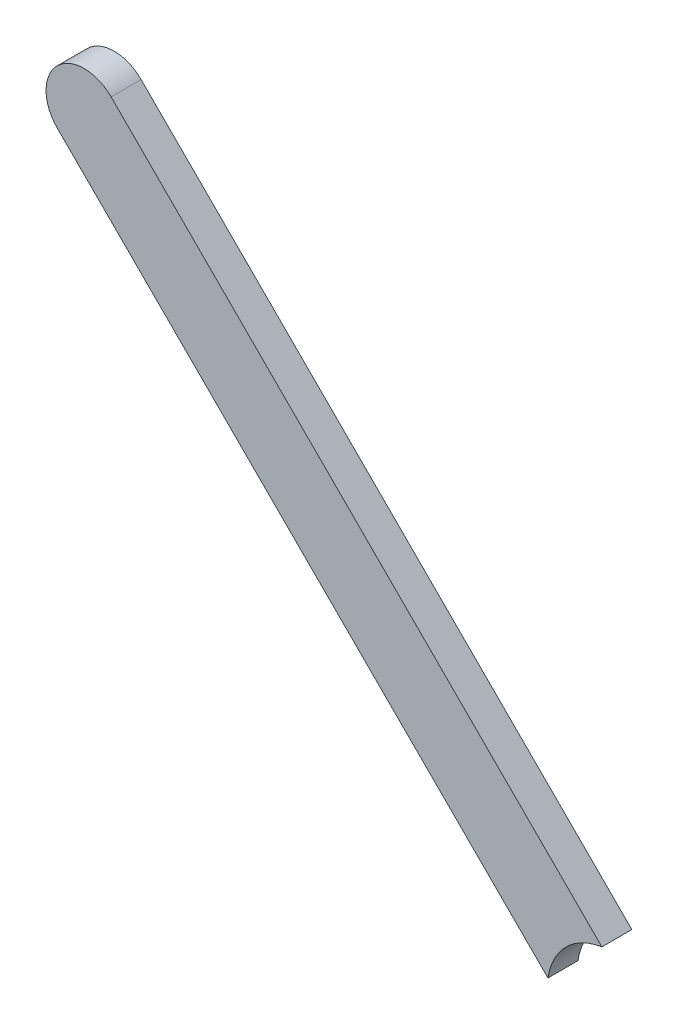
ISO-10303-21;
HEADER;
FILE_DESCRIPTION(('STEP AP214'),'2;1');
FILE_NAME('part.step','',(''),(''),'','','');
FILE_SCHEMA(('AUTOMOTIVE_DESIGN { 1 0 10303 214 1 1 1 1 }'));
ENDSEC;
DATA;
#1=APPLICATION_CONTEXT('core data for automotive mechanical design processes');
#2=APPLICATION_PROTOCOL_DEFINITION('international standard','automotive_design',2000,#1);
#3=PRODUCT_CONTEXT('',#1,'mechanical');
#4=PRODUCT('Part','Part','',(#3));
#5=PRODUCT_RELATED_PRODUCT_CATEGORY('part','',(#4));
#6=PRODUCT_DEFINITION_FORMATION('','',#4);
#7=PRODUCT_DEFINITION_CONTEXT('part definition',#1,'design');
#8=PRODUCT_DEFINITION('design','',#6,#7);
#9=PRODUCT_DEFINITION_SHAPE('','',#8);
#10=(LENGTH_UNIT() NAMED_UNIT(*) SI_UNIT(.MILLI.,.METRE.));
#11=(NAMED_UNIT(*) PLANE_ANGLE_UNIT() SI_UNIT($,.RADIAN.));
#12=(NAMED_UNIT(*) SI_UNIT($,.STERADIAN.) SOLID_ANGLE_UNIT());
#13=UNCERTAINTY_MEASURE_WITH_UNIT(LENGTH_MEASURE(1.E-05),#10,'distance_accuracy_value','');
#14=(GEOMETRIC_REPRESENTATION_CONTEXT(3) GLOBAL_UNCERTAINTY_ASSIGNED_CONTEXT((#13)) GLOBAL_UNIT_ASSIGNED_CONTEXT((#10,
#11,#12)) REPRESENTATION_CONTEXT('',''));
#15=CARTESIAN_POINT('',(0.,0.,0.));
#16=DIRECTION('',(0.,0.,1.));
#17=DIRECTION('',(1.,0.,0.));
#18=AXIS2_PLACEMENT_3D('',#15,#16,#17);
#19=CARTESIAN_POINT('',(99.7693966,61.49840126,0.));
#20=DIRECTION('',(0.707106781186549,0.707106781186546,0.));
#21=DIRECTION('',(0.707106781186546,-0.707106781186549,0.));
#22=AXIS2_PLACEMENT_3D('',#19,#20,#21);
#23=PLANE('',#22);
#24=DIRECTION('',(0.707106781186546,-0.707106781186549,0.));
#25=VECTOR('',#24,1.);
#26=CARTESIAN_POINT('',(99.7693966,61.49840126,0.1999996));
#27=LINE('',#26,#25);
#28=CARTESIAN_POINT('',(99.7693966,61.49840126,0.1999996));
#29=VERTEX_POINT('',#28);
#30=CARTESIAN_POINT('',(103.040456807867,58.2273410521332,0.1999996));
#31=VERTEX_POINT('',#30);
#32=EDGE_CURVE('E11',#29,#31,#27,.T.);
#33=ORIENTED_EDGE('',*,*,#32,.F.);
#34=DIRECTION('',(0.,0.,1.));
#35=VECTOR('',#34,1.);
#36=CARTESIAN_POINT('',(99.7693966,61.49840126,0.));
#37=LINE('',#36,#35);
#38=CARTESIAN_POINT('',(99.7693966,61.49840126,0.));
#39=VERTEX_POINT('',#38);
#40=EDGE_CURVE('E24',#39,#29,#37,.T.);
#41=ORIENTED_EDGE('',*,*,#40,.F.);
#42=DIRECTION('',(0.707106781186546,-0.707106781186549,0.));
#43=VECTOR('',#42,1.);
#44=CARTESIAN_POINT('',(99.7693966,61.49840126,0.));
#45=LINE('',#44,#43);
#46=CARTESIAN_POINT('',(103.040456807867,58.2273410521332,0.));
#47=VERTEX_POINT('',#46);
#48=EDGE_CURVE('E75',#39,#47,#45,.T.);
#49=ORIENTED_EDGE('',*,*,#48,.T.);
#50=DIRECTION('',(0.,0.,1.));
#51=VECTOR('',#50,1.);
#52=CARTESIAN_POINT('',(103.040456807867,58.2273410521332,0.));
#53=LINE('',#52,#51);
#54=EDGE_CURVE('E37',#47,#31,#53,.T.);
#55=ORIENTED_EDGE('',*,*,#54,.T.);
#56=EDGE_LOOP('',(#33,#41,#49,#55));
#57=FACE_BOUND('',#56,.T.);
#58=ADVANCED_FACE('F17',(#57),#23,.F.);
#59=CARTESIAN_POINT('',(103.4610072,58.166,0.));
#60=DIRECTION('',(0.,0.,-1.));
#61=DIRECTION('',(1.,0.,0.));
#62=AXIS2_PLACEMENT_3D('',#59,#60,#61);
#63=CYLINDRICAL_SURFACE('',#62,0.42500042);
#64=DIRECTION('',(0.,0.,1.));
#65=VECTOR('',#64,1.);
#66=CARTESIAN_POINT('',(103.399666147867,58.5865503921332,0.));
#67=LINE('',#66,#65);
#68=CARTESIAN_POINT('',(103.399666147867,58.5865503921332,0.));
#69=VERTEX_POINT('',#68);
#70=CARTESIAN_POINT('',(103.399666147867,58.5865503921332,0.1999996));
#71=VERTEX_POINT('',#70);
#72=EDGE_CURVE('E67',#69,#71,#67,.T.);
#73=ORIENTED_EDGE('',*,*,#72,.T.);
#74=CARTESIAN_POINT('',(103.4610072,58.166,0.1999996));
#75=DIRECTION('',(0.,0.,1.));
#76=DIRECTION('',(1.,0.,0.));
#77=AXIS2_PLACEMENT_3D('',#74,#75,#76);
#78=CIRCLE('',#77,0.42500042);
#79=EDGE_CURVE('E82',#71,#31,#78,.T.);
#80=ORIENTED_EDGE('',*,*,#79,.T.);
#81=ORIENTED_EDGE('',*,*,#54,.F.);
#82=CARTESIAN_POINT('',(103.4610072,58.166,0.));
#83=DIRECTION('',(0.,0.,1.));
#84=DIRECTION('',(1.,0.,0.));
#85=AXIS2_PLACEMENT_3D('',#82,#83,#84);
#86=CIRCLE('',#85,0.42500042);
#87=EDGE_CURVE('E80',#69,#47,#86,.T.);
#88=ORIENTED_EDGE('',*,*,#87,.F.);
#89=EDGE_LOOP('',(#73,#80,#81,#88));
#90=FACE_BOUND('',#89,.T.);
#91=ADVANCED_FACE('F88',(#90),#63,.F.);
#92=CARTESIAN_POINT('',(103.399666147867,58.5865503921332,0.));
#93=DIRECTION('',(-0.707106781186547,-0.707106781186548,0.));
#94=DIRECTION('',(-0.707106781186548,0.707106781186547,0.));
#95=AXIS2_PLACEMENT_3D('',#92,#93,#94);
#96=PLANE('',#95);
#97=DIRECTION('',(-0.707106781186548,0.707106781186547,0.));
#98=VECTOR('',#97,1.);
#99=CARTESIAN_POINT('',(103.6406106,58.34560594,0.1999996));
#100=LINE('',#99,#98);
#101=CARTESIAN_POINT('',(100.12860594,61.8576106,0.1999996));
#102=VERTEX_POINT('',#101);
#103=EDGE_CURVE('E71',#71,#102,#100,.T.);
#104=ORIENTED_EDGE('',*,*,#103,.F.);
#105=ORIENTED_EDGE('',*,*,#72,.F.);
#106=DIRECTION('',(-0.707106781186548,0.707106781186547,0.));
#107=VECTOR('',#106,1.);
#108=CARTESIAN_POINT('',(103.6406106,58.34560594,0.));
#109=LINE('',#108,#107);
#110=CARTESIAN_POINT('',(100.12860594,61.8576106,0.));
#111=VERTEX_POINT('',#110);
#112=EDGE_CURVE('E63',#69,#111,#109,.T.);
#113=ORIENTED_EDGE('',*,*,#112,.T.);
#114=DIRECTION('',(0.,0.,1.));
#115=VECTOR('',#114,1.);
#116=CARTESIAN_POINT('',(100.12860594,61.8576106,0.));
#117=LINE('',#116,#115);
#118=EDGE_CURVE('E53',#111,#102,#117,.T.);
#119=ORIENTED_EDGE('',*,*,#118,.T.);
#120=EDGE_LOOP('',(#104,#105,#113,#119));
#121=FACE_BOUND('',#120,.T.);
#122=ADVANCED_FACE('F66',(#121),#96,.F.);
#123=CARTESIAN_POINT('',(99.94900127,61.67800593,0.));
#124=DIRECTION('',(0.,0.,-1.));
#125=DIRECTION('',(0.70710678118652,0.707106781186576,0.));
#126=AXIS2_PLACEMENT_3D('',#123,#124,#125);
#127=CYLINDRICAL_SURFACE('',#126,0.253999360179537);
#128=CARTESIAN_POINT('',(99.94900127,61.67800593,0.1999996));
#129=DIRECTION('',(0.,0.,1.));
#130=DIRECTION('',(0.70710678118652,0.707106781186576,0.));
#131=AXIS2_PLACEMENT_3D('',#128,#129,#130);
#132=CIRCLE('',#131,0.253999360179537);
#133=EDGE_CURVE('E59',#102,#29,#132,.T.);
#134=ORIENTED_EDGE('',*,*,#133,.F.);
#135=ORIENTED_EDGE('',*,*,#118,.F.);
#136=CARTESIAN_POINT('',(99.94900127,61.67800593,0.));
#137=DIRECTION('',(0.,0.,1.));
#138=DIRECTION('',(0.70710678118652,0.707106781186576,0.));
#139=AXIS2_PLACEMENT_3D('',#136,#137,#138);
#140=CIRCLE('',#139,0.253999360179537);
#141=EDGE_CURVE('E57',#111,#39,#140,.T.);
#142=ORIENTED_EDGE('',*,*,#141,.T.);
#143=ORIENTED_EDGE('',*,*,#40,.T.);
#144=EDGE_LOOP('',(#134,#135,#142,#143));
#145=FACE_BOUND('',#144,.T.);
#146=ADVANCED_FACE('F55',(#145),#127,.T.);
#147=CARTESIAN_POINT('',(99.7693966,61.49840126,0.));
#148=DIRECTION('',(0.,0.,-1.));
#149=DIRECTION('',(-1.,0.,0.));
#150=AXIS2_PLACEMENT_3D('',#147,#148,#149);
#151=PLANE('',#150);
#152=ORIENTED_EDGE('',*,*,#48,.F.);
#153=ORIENTED_EDGE('',*,*,#141,.F.);
#154=ORIENTED_EDGE('',*,*,#112,.F.);
#155=ORIENTED_EDGE('',*,*,#87,.T.);
#156=EDGE_LOOP('',(#152,#153,#154,#155));
#157=FACE_BOUND('',#156,.T.);
#158=ADVANCED_FACE('F74',(#157),#151,.T.);
#159=CARTESIAN_POINT('',(99.7693966,61.49840126,0.1999996));
#160=DIRECTION('',(0.,0.,-1.));
#161=DIRECTION('',(-1.,0.,0.));
#162=AXIS2_PLACEMENT_3D('',#159,#160,#161);
#163=PLANE('',#162);
#164=ORIENTED_EDGE('',*,*,#133,.T.);
#165=ORIENTED_EDGE('',*,*,#32,.T.);
#166=ORIENTED_EDGE('',*,*,#79,.F.);
#167=ORIENTED_EDGE('',*,*,#103,.T.);
#168=EDGE_LOOP('',(#164,#165,#166,#167));
#169=FACE_BOUND('',#168,.T.);
#170=ADVANCED_FACE('F91',(#169),#163,.F.);
#171=CLOSED_SHELL('',(#58,#91,#122,#146,#158,#170));
#172=MANIFOLD_SOLID_BREP('B1',#171);
#173=ADVANCED_BREP_SHAPE_REPRESENTATION('',(#18,#172),#14);
#174=SHAPE_DEFINITION_REPRESENTATION(#9,#173);
ENDSEC;
END-ISO-10303-21;
